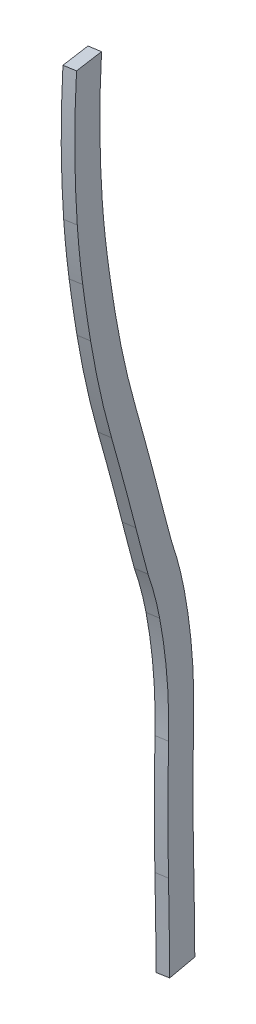
ISO-10303-21;
HEADER;
FILE_DESCRIPTION(('STEP AP214'),'2;1');
FILE_NAME('part.step','',(''),(''),'','','');
FILE_SCHEMA(('AUTOMOTIVE_DESIGN { 1 0 10303 214 1 1 1 1 }'));
ENDSEC;
DATA;
#1=APPLICATION_CONTEXT('core data for automotive mechanical design processes');
#2=APPLICATION_PROTOCOL_DEFINITION('international standard','automotive_design',2000,#1);
#3=PRODUCT_CONTEXT('',#1,'mechanical');
#4=PRODUCT('Part','Part','',(#3));
#5=PRODUCT_RELATED_PRODUCT_CATEGORY('part','',(#4));
#6=PRODUCT_DEFINITION_FORMATION('','',#4);
#7=PRODUCT_DEFINITION_CONTEXT('part definition',#1,'design');
#8=PRODUCT_DEFINITION('design','',#6,#7);
#9=PRODUCT_DEFINITION_SHAPE('','',#8);
#10=(LENGTH_UNIT() NAMED_UNIT(*) SI_UNIT(.MILLI.,.METRE.));
#11=(NAMED_UNIT(*) PLANE_ANGLE_UNIT() SI_UNIT($,.RADIAN.));
#12=(NAMED_UNIT(*) SI_UNIT($,.STERADIAN.) SOLID_ANGLE_UNIT());
#13=UNCERTAINTY_MEASURE_WITH_UNIT(LENGTH_MEASURE(1.E-05),#10,'distance_accuracy_value','');
#14=(GEOMETRIC_REPRESENTATION_CONTEXT(3) GLOBAL_UNCERTAINTY_ASSIGNED_CONTEXT((#13)) GLOBAL_UNIT_ASSIGNED_CONTEXT((#10,
#11,#12)) REPRESENTATION_CONTEXT('',''));
#15=CARTESIAN_POINT('',(0.,0.,0.));
#16=DIRECTION('',(0.,0.,1.));
#17=DIRECTION('',(1.,0.,0.));
#18=AXIS2_PLACEMENT_3D('',#15,#16,#17);
#19=CARTESIAN_POINT('',(0.,825.,-1425.));
#20=DIRECTION('',(0.,-1.,0.));
#21=DIRECTION('',(1.,0.,0.));
#22=AXIS2_PLACEMENT_3D('',#19,#20,#21);
#23=PLANE('',#22);
#24=CARTESIAN_POINT('',(-13361.9749270405,825.,8113.05481453009));
#25=DIRECTION('',(0.,-1.,0.));
#26=DIRECTION('',(-0.983765245959672,0.,0.179460137194605));
#27=AXIS2_PLACEMENT_3D('',#24,#25,#26);
#28=ELLIPSE('',#27,448122.561313768,7038.47733663514);
#29=CARTESIAN_POINT('',(-720.427019288018,825.,-1344.10961444261));
#30=VERTEX_POINT('',#29);
#31=CARTESIAN_POINT('',(-705.667385032109,825.,-1346.79453017466));
#32=VERTEX_POINT('',#31);
#33=EDGE_CURVE('E164',#30,#32,#28,.T.);
#34=ORIENTED_EDGE('',*,*,#33,.T.);
#35=DIRECTION('',(0.179460137194605,0.,0.983765245959672));
#36=VECTOR('',#35,1.);
#37=CARTESIAN_POINT('',(556.828996534096,825.,5573.96281878388));
#38=LINE('',#37,#36);
#39=CARTESIAN_POINT('',(-698.485378511231,825.,-1307.42418017972));
#40=VERTEX_POINT('',#39);
#41=EDGE_CURVE('E314',#32,#40,#38,.T.);
#42=ORIENTED_EDGE('',*,*,#41,.T.);
#43=CARTESIAN_POINT('',(-13361.9749270405,825.,8113.05481453009));
#44=DIRECTION('',(0.,-1.,0.));
#45=DIRECTION('',(-0.983765245959672,0.,0.179460137194605));
#46=AXIS2_PLACEMENT_3D('',#43,#44,#45);
#47=ELLIPSE('',#46,445575.85957769,6998.47733663514);
#48=CARTESIAN_POINT('',(-713.245020405277,825.,-1304.73930631841));
#49=VERTEX_POINT('',#48);
#50=EDGE_CURVE('E32',#40,#49,#47,.F.);
#51=ORIENTED_EDGE('',*,*,#50,.T.);
#52=DIRECTION('',(0.179460137194605,0.,0.983765245959672));
#53=VECTOR('',#52,1.);
#54=CARTESIAN_POINT('',(542.070697318572,825.,5576.65505294529));
#55=LINE('',#54,#53);
#56=EDGE_CURVE('E11',#30,#49,#55,.T.);
#57=ORIENTED_EDGE('',*,*,#56,.F.);
#58=EDGE_LOOP('',(#34,#42,#51,#57));
#59=FACE_BOUND('',#58,.T.);
#60=ADVANCED_FACE('F17',(#59),#23,.T.);
#61=CARTESIAN_POINT('',(553.395269791667,602.802702860898,5574.58920508368));
#62=DIRECTION('',(-0.983643892522552,0.0157065899918101,0.179437999693241));
#63=DIRECTION('',(-0.179284144970904,0.0107209315098688,-0.983738917086039));
#64=AXIS2_PLACEMENT_3D('',#61,#62,#63);
#65=CYLINDRICAL_SURFACE('',#64,6998.47733663514);
#66=ORIENTED_EDGE('',*,*,#50,.F.);
#67=CARTESIAN_POINT('',(553.395269791667,602.802702860898,5574.58920508368));
#68=DIRECTION('',(0.983643892522552,-0.0157065899918101,-0.179437999693241));
#69=DIRECTION('',(-0.179284144970904,0.0107209315098688,-0.983738917086039));
#70=AXIS2_PLACEMENT_3D('',#67,#68,#69);
#71=CIRCLE('',#70,6998.47733663514);
#72=CARTESIAN_POINT('',(-695.896046515676,939.439296835912,-1303.24708563971));
#73=VERTEX_POINT('',#72);
#74=EDGE_CURVE('E177',#40,#73,#71,.T.);
#75=ORIENTED_EDGE('',*,*,#74,.T.);
#76=DIRECTION('',(-0.983643892522552,0.0157065899918101,0.179437999693241));
#77=VECTOR('',#76,1.);
#78=CARTESIAN_POINT('',(-695.896046515676,939.439296835912,-1303.24708563971));
#79=LINE('',#78,#77);
#80=CARTESIAN_POINT('',(-710.650704903515,939.674895685789,-1300.55551564431));
#81=VERTEX_POINT('',#80);
#82=EDGE_CURVE('E25',#73,#81,#79,.T.);
#83=ORIENTED_EDGE('',*,*,#82,.T.);
#84=CARTESIAN_POINT('',(538.64061140383,603.038301710775,5577.28077507908));
#85=DIRECTION('',(0.983643892522552,-0.0157065899918101,-0.179437999693241));
#86=DIRECTION('',(-0.179284144970904,0.0107209315098688,-0.983738917086039));
#87=AXIS2_PLACEMENT_3D('',#84,#85,#86);
#88=CIRCLE('',#87,6998.47733663514);
#89=EDGE_CURVE('E300',#49,#81,#88,.T.);
#90=ORIENTED_EDGE('',*,*,#89,.F.);
#91=EDGE_LOOP('',(#66,#75,#83,#90));
#92=FACE_BOUND('',#91,.T.);
#93=ADVANCED_FACE('F19',(#92),#65,.F.);
#94=CARTESIAN_POINT('',(553.395269791667,602.802702860898,5574.58920508368));
#95=DIRECTION('',(-0.983643892522552,0.0157065899918101,0.179437999693241));
#96=DIRECTION('',(-0.179284144970904,0.0107209315098688,-0.983738917086039));
#97=AXIS2_PLACEMENT_3D('',#94,#95,#96);
#98=CYLINDRICAL_SURFACE('',#97,7038.47733663514);
#99=ORIENTED_EDGE('',*,*,#33,.F.);
#100=CARTESIAN_POINT('',(538.64061140383,603.038301710775,5577.28077507908));
#101=DIRECTION('',(-0.983643892522552,0.0157065899918101,0.179437999693241));
#102=DIRECTION('',(-0.179284144970904,0.0107209315098688,-0.983738917086039));
#103=AXIS2_PLACEMENT_3D('',#100,#101,#102);
#104=CIRCLE('',#103,7038.47733663514);
#105=CARTESIAN_POINT('',(-717.79106562037,941.598951892658,-1339.86598825081));
#106=VERTEX_POINT('',#105);
#107=EDGE_CURVE('E170',#106,#30,#104,.T.);
#108=ORIENTED_EDGE('',*,*,#107,.F.);
#109=DIRECTION('',(-0.983643892522552,0.0157065899918101,0.179437999693241));
#110=VECTOR('',#109,1.);
#111=CARTESIAN_POINT('',(-703.036407232532,941.363353042781,-1342.55755824621));
#112=LINE('',#111,#110);
#113=CARTESIAN_POINT('',(-703.036407232532,941.363353042781,-1342.55755824621));
#114=VERTEX_POINT('',#113);
#115=EDGE_CURVE('E242',#114,#106,#112,.T.);
#116=ORIENTED_EDGE('',*,*,#115,.F.);
#117=CARTESIAN_POINT('',(553.395269791667,602.802702860898,5574.58920508368));
#118=DIRECTION('',(-0.983643892522552,0.0157065899918101,0.179437999693241));
#119=DIRECTION('',(-0.179284144970904,0.0107209315098688,-0.983738917086039));
#120=AXIS2_PLACEMENT_3D('',#117,#118,#119);
#121=CIRCLE('',#120,7038.47733663514);
#122=EDGE_CURVE('E39',#114,#32,#121,.T.);
#123=ORIENTED_EDGE('',*,*,#122,.T.);
#124=EDGE_LOOP('',(#99,#108,#116,#123));
#125=FACE_BOUND('',#124,.T.);
#126=ADVANCED_FACE('F169',(#125),#98,.T.);
#127=CARTESIAN_POINT('',(553.395269791667,602.802702860898,5574.58920508368));
#128=DIRECTION('',(-0.983643892522552,0.0157065899918101,0.179437999693241));
#129=DIRECTION('',(-0.179284144970904,0.0107209315098688,-0.983738917086039));
#130=AXIS2_PLACEMENT_3D('',#127,#128,#129);
#131=PLANE('',#130);
#132=ORIENTED_EDGE('',*,*,#41,.F.);
#133=ORIENTED_EDGE('',*,*,#122,.F.);
#134=CARTESIAN_POINT('',(-1219.22901401691,1080.45766892773,-4184.39932693663));
#135=DIRECTION('',(0.98364389252255,-0.0157065899918103,-0.179437999693253));
#136=DIRECTION('',(0.178509017921332,-0.0481014051745877,0.982761815162246));
#137=AXIS2_PLACEMENT_3D('',#134,#135,#136);
#138=CIRCLE('',#137,2891.68924234329);
#139=CARTESIAN_POINT('',(-700.077989029998,1094.30764319442,-1339.72762957827));
#140=VERTEX_POINT('',#139);
#141=EDGE_CURVE('E238',#140,#114,#138,.T.);
#142=ORIENTED_EDGE('',*,*,#141,.F.);
#143=CARTESIAN_POINT('',(-583.977924602023,1097.40497485186,-703.560981639801));
#144=DIRECTION('',(-0.983643892522549,0.0157065899918104,0.179437999693254));
#145=DIRECTION('',(-0.179532094038646,-0.00478957906813383,-0.983740457205277));
#146=AXIS2_PLACEMENT_3D('',#143,#144,#145);
#147=CIRCLE('',#146,646.681391701386);
#148=CARTESIAN_POINT('',(-694.267757230317,1252.14837018478,-1321.6932140889));
#149=VERTEX_POINT('',#148);
#150=EDGE_CURVE('E235',#149,#140,#147,.T.);
#151=ORIENTED_EDGE('',*,*,#150,.F.);
#152=CARTESIAN_POINT('',(-614.018625324626,1139.55391929412,-871.927593134996));
#153=DIRECTION('',(-0.983643892522549,0.0157065899918102,0.179437999693254));
#154=DIRECTION('',(-0.170547404090488,0.239288461549506,-0.955852820850191));
#155=AXIS2_PLACEMENT_3D('',#152,#153,#154);
#156=CIRCLE('',#155,470.538571569894);
#157=CARTESIAN_POINT('',(-689.440511209819,1317.48076330475,-1300.94988235197));
#158=VERTEX_POINT('',#157);
#159=EDGE_CURVE('E232',#158,#149,#156,.T.);
#160=ORIENTED_EDGE('',*,*,#159,.F.);
#161=CARTESIAN_POINT('',(-1591.75285028647,3040.81212301513,-6398.09587222628));
#162=DIRECTION('',(0.983643892522551,-0.0157065899918134,-0.179437999693245));
#163=DIRECTION('',(0.165379401888751,-0.31599222365054,0.934236890742014));
#164=AXIS2_PLACEMENT_3D('',#161,#162,#163);
#165=CIRCLE('',#164,5455.72504573892);
#166=CARTESIAN_POINT('',(-684.829292871299,1379.77772111795,-1281.12507385128));
#167=VERTEX_POINT('',#166);
#168=EDGE_CURVE('E229',#167,#158,#165,.T.);
#169=ORIENTED_EDGE('',*,*,#168,.F.);
#170=CARTESIAN_POINT('',(254.030528232484,-339.748085286874,4016.03393042758));
#171=DIRECTION('',(-0.983643892522544,0.0157065899918008,0.179437999693284));
#172=DIRECTION('',(-0.166233369499392,0.304457132273249,-0.937908482461283));
#173=AXIS2_PLACEMENT_3D('',#170,#171,#172);
#174=CIRCLE('',#173,5647.84209049685);
#175=CARTESIAN_POINT('',(-675.364600195873,1505.70026639228,-1240.26375479975));
#176=VERTEX_POINT('',#175);
#177=EDGE_CURVE('E226',#176,#167,#174,.T.);
#178=ORIENTED_EDGE('',*,*,#177,.F.);
#179=CARTESIAN_POINT('',(-855.383266577352,1863.15334634015,-2258.3793769453));
#180=DIRECTION('',(0.98364389252255,-0.0157065899918113,-0.179437999693251));
#181=DIRECTION('',(0.164557562611741,-0.326752823841228,0.930673627379151));
#182=AXIS2_PLACEMENT_3D('',#179,#180,#181);
#183=CIRCLE('',#182,1093.95559538164);
#184=CARTESIAN_POINT('',(-667.136477576721,1630.73672037302,-1206.10350861427));
#185=VERTEX_POINT('',#184);
#186=EDGE_CURVE('E223',#185,#176,#183,.T.);
#187=ORIENTED_EDGE('',*,*,#186,.F.);
#188=CARTESIAN_POINT('',(-1006.12746733741,2049.26785437904,-3101.02049498356));
#189=DIRECTION('',(0.983643892522547,-0.0157065899918063,-0.179437999693274));
#190=DIRECTION('',(0.172079003750589,-0.21245526504762,0.961899982753794));
#191=AXIS2_PLACEMENT_3D('',#188,#189,#190);
#192=CIRCLE('',#191,1969.97299131286);
#193=CARTESIAN_POINT('',(-663.566059583929,1700.61499243701,-1192.64777188156));
#194=VERTEX_POINT('',#193);
#195=EDGE_CURVE('E220',#194,#185,#192,.T.);
#196=ORIENTED_EDGE('',*,*,#195,.F.);
#197=CARTESIAN_POINT('',(-832.792059887472,1872.85018293253,-2135.3876010317));
#198=DIRECTION('',(0.983643892522547,-0.015706589991809,-0.179437999693267));
#199=DIRECTION('',(0.173891423519045,-0.176983574637577,0.968730399613342));
#200=AXIS2_PLACEMENT_3D('',#197,#198,#199);
#201=CIRCLE('',#200,973.170481205524);
#202=CARTESIAN_POINT('',(-660.699816080751,1770.42501455506,-1183.04620741583));
#203=VERTEX_POINT('',#202);
#204=EDGE_CURVE('E217',#203,#194,#201,.T.);
#205=ORIENTED_EDGE('',*,*,#204,.F.);
#206=CARTESIAN_POINT('',(-857.955483133816,1887.82684780684,-2274.63948730208));
#207=DIRECTION('',(0.98364389252255,-0.0157065899918109,-0.179437999693249));
#208=DIRECTION('',(0.176836687024787,-0.105248946978523,0.9785966714035));
#209=AXIS2_PLACEMENT_3D('',#206,#207,#208);
#210=CIRCLE('',#209,1115.46800820474);
#211=CARTESIAN_POINT('',(-657.187789429413,1939.79237158444,-1178.61905189434));
#212=VERTEX_POINT('',#211);
#213=EDGE_CURVE('E214',#212,#203,#210,.T.);
#214=ORIENTED_EDGE('',*,*,#213,.F.);
#215=DIRECTION('',(-0.179985165175218,-0.0465862968685581,-0.982565548582344));
#216=VECTOR('',#215,1.);
#217=CARTESIAN_POINT('',(-649.988382822404,1941.65582345919,-1139.31642995104));
#218=LINE('',#217,#216);
#219=CARTESIAN_POINT('',(-649.988382822404,1941.65582345919,-1139.31642995104));
#220=VERTEX_POINT('',#219);
#221=EDGE_CURVE('E211',#220,#212,#218,.T.);
#222=ORIENTED_EDGE('',*,*,#221,.F.);
#223=CARTESIAN_POINT('',(-857.955483133816,1887.82684780684,-2274.63948730208));
#224=DIRECTION('',(-0.98364389252255,0.0157065899918109,0.179437999693249));
#225=DIRECTION('',(0.176836687024787,-0.105248946978523,0.9785966714035));
#226=AXIS2_PLACEMENT_3D('',#223,#224,#225);
#227=CIRCLE('',#226,1155.46800820474);
#228=CARTESIAN_POINT('',(-653.626348599759,1766.21505667592,-1143.90234055969));
#229=VERTEX_POINT('',#228);
#230=EDGE_CURVE('E208',#229,#220,#227,.T.);
#231=ORIENTED_EDGE('',*,*,#230,.F.);
#232=CARTESIAN_POINT('',(-832.792059887472,1872.85018293253,-2135.3876010317));
#233=DIRECTION('',(-0.983643892522547,0.015706589991809,0.179437999693267));
#234=DIRECTION('',(0.173891423519045,-0.176983574637577,0.968730399613342));
#235=AXIS2_PLACEMENT_3D('',#232,#233,#234);
#236=CIRCLE('',#235,1013.17048120552);
#237=CARTESIAN_POINT('',(-656.610402643167,1693.5356494515,-1153.89855589703));
#238=VERTEX_POINT('',#237);
#239=EDGE_CURVE('E205',#238,#229,#236,.T.);
#240=ORIENTED_EDGE('',*,*,#239,.F.);
#241=CARTESIAN_POINT('',(-1006.12746733741,2049.26785437904,-3101.02049498356));
#242=DIRECTION('',(-0.983643892522546,0.0157065899918064,0.179437999693273));
#243=DIRECTION('',(0.172079003750589,-0.21245526504762,0.961899982753794));
#244=AXIS2_PLACEMENT_3D('',#241,#242,#243);
#245=CIRCLE('',#244,2009.97299131286);
#246=CARTESIAN_POINT('',(-660.253317426698,1622.23850977111,-1167.62750930412));
#247=VERTEX_POINT('',#246);
#248=EDGE_CURVE('E202',#247,#238,#245,.T.);
#249=ORIENTED_EDGE('',*,*,#248,.F.);
#250=CARTESIAN_POINT('',(-855.383266577352,1863.15334634015,-2258.3793769453));
#251=DIRECTION('',(-0.98364389252255,0.0157065899918112,0.17943799969325));
#252=DIRECTION('',(0.164557562611741,-0.326752823841228,0.930673627379151));
#253=AXIS2_PLACEMENT_3D('',#250,#251,#252);
#254=CIRCLE('',#253,1133.95559538164);
#255=CARTESIAN_POINT('',(-668.782297691407,1492.63015343858,-1203.0368097046));
#256=VERTEX_POINT('',#255);
#257=EDGE_CURVE('E199',#256,#247,#254,.T.);
#258=ORIENTED_EDGE('',*,*,#257,.F.);
#259=CARTESIAN_POINT('',(254.030528232484,-339.748085286874,4016.03393042758));
#260=DIRECTION('',(0.983643892522545,-0.0157065899918008,-0.179437999693284));
#261=DIRECTION('',(-0.166233369499392,0.304457132273249,-0.937908482461283));
#262=AXIS2_PLACEMENT_3D('',#259,#260,#261);
#263=CIRCLE('',#262,5607.84209049685);
#264=CARTESIAN_POINT('',(-678.179958091323,1367.59943582703,-1243.60873455283));
#265=VERTEX_POINT('',#264);
#266=EDGE_CURVE('E196',#265,#256,#263,.T.);
#267=ORIENTED_EDGE('',*,*,#266,.F.);
#268=CARTESIAN_POINT('',(-1591.75285028647,3040.81212301513,-6398.09587222628));
#269=DIRECTION('',(-0.983643892522552,0.0157065899918134,0.179437999693245));
#270=DIRECTION('',(0.165379401888751,-0.31599222365054,0.934236890742014));
#271=AXIS2_PLACEMENT_3D('',#268,#269,#270);
#272=CIRCLE('',#271,5495.72504573892);
#273=CARTESIAN_POINT('',(-682.922101044978,1303.55497544569,-1263.99828347574));
#274=VERTEX_POINT('',#273);
#275=EDGE_CURVE('E193',#274,#265,#272,.T.);
#276=ORIENTED_EDGE('',*,*,#275,.F.);
#277=CARTESIAN_POINT('',(-614.018625324626,1139.55391929412,-871.927593134996));
#278=DIRECTION('',(0.98364389252255,-0.0157065899918102,-0.179437999693254));
#279=DIRECTION('',(-0.170547404090488,0.239288461549505,-0.955852820850191));
#280=AXIS2_PLACEMENT_3D('',#277,#278,#279);
#281=CIRCLE('',#280,430.538571569894);
#282=CARTESIAN_POINT('',(-687.445861066698,1242.5768317228,-1283.45910125489));
#283=VERTEX_POINT('',#282);
#284=EDGE_CURVE('E190',#283,#274,#281,.T.);
#285=ORIENTED_EDGE('',*,*,#284,.F.);
#286=CARTESIAN_POINT('',(-583.977924602023,1097.40497485186,-703.560981639801));
#287=DIRECTION('',(0.983643892522549,-0.0157065899918104,-0.179437999693253));
#288=DIRECTION('',(-0.179532094038646,-0.00478957906813377,-0.983740457205277));
#289=AXIS2_PLACEMENT_3D('',#286,#287,#288);
#290=CIRCLE('',#289,606.681391701386);
#291=CARTESIAN_POINT('',(-692.896705268452,1094.49922635715,-1300.37801129006));
#292=VERTEX_POINT('',#291);
#293=EDGE_CURVE('E187',#292,#283,#290,.T.);
#294=ORIENTED_EDGE('',*,*,#293,.F.);
#295=CARTESIAN_POINT('',(-1219.22901401691,1080.45766892773,-4184.39932693663));
#296=DIRECTION('',(-0.98364389252255,0.0157065899918102,0.179437999693253));
#297=DIRECTION('',(0.178509017921332,-0.0481014051745877,0.982761815162246));
#298=AXIS2_PLACEMENT_3D('',#295,#296,#297);
#299=CIRCLE('',#298,2931.68924234329);
#300=EDGE_CURVE('E179',#73,#292,#299,.T.);
#301=ORIENTED_EDGE('',*,*,#300,.F.);
#302=ORIENTED_EDGE('',*,*,#74,.F.);
#303=EDGE_LOOP('',(#132,#133,#142,#151,#160,#169,#178,#187,#196,#205,#214,#222,#231,#240,#249,
#258,#267,#276,#285,#294,#301,#302));
#304=FACE_BOUND('',#303,.T.);
#305=ADVANCED_FACE('F368',(#304),#131,.F.);
#306=CARTESIAN_POINT('',(538.64061140383,603.038301710775,5577.28077507908));
#307=DIRECTION('',(-0.983643892522552,0.0157065899918101,0.179437999693241));
#308=DIRECTION('',(-0.179284144970904,0.0107209315098688,-0.983738917086039));
#309=AXIS2_PLACEMENT_3D('',#306,#307,#308);
#310=PLANE('',#309);
#311=ORIENTED_EDGE('',*,*,#107,.T.);
#312=ORIENTED_EDGE('',*,*,#56,.T.);
#313=ORIENTED_EDGE('',*,*,#89,.T.);
#314=CARTESIAN_POINT('',(-1233.98367240475,1080.69326777761,-4181.70775694124));
#315=DIRECTION('',(-0.98364389252255,0.0157065899918102,0.179437999693253));
#316=DIRECTION('',(0.178509017921332,-0.0481014051745877,0.982761815162246));
#317=AXIS2_PLACEMENT_3D('',#314,#315,#316);
#318=CIRCLE('',#317,2931.68924234329);
#319=CARTESIAN_POINT('',(-707.65136365629,1094.73482520703,-1297.68644129466));
#320=VERTEX_POINT('',#319);
#321=EDGE_CURVE('E307',#81,#320,#318,.T.);
#322=ORIENTED_EDGE('',*,*,#321,.T.);
#323=CARTESIAN_POINT('',(-598.73258298986,1097.64057370174,-700.869411644403));
#324=DIRECTION('',(0.983643892522549,-0.0157065899918104,-0.179437999693253));
#325=DIRECTION('',(-0.179532094038646,-0.00478957906813377,-0.983740457205277));
#326=AXIS2_PLACEMENT_3D('',#323,#324,#325);
#327=CIRCLE('',#326,606.681391701386);
#328=CARTESIAN_POINT('',(-702.200519454536,1242.81243057268,-1280.76753125949));
#329=VERTEX_POINT('',#328);
#330=EDGE_CURVE('E310',#320,#329,#327,.T.);
#331=ORIENTED_EDGE('',*,*,#330,.T.);
#332=CARTESIAN_POINT('',(-628.773283712464,1139.789518144,-869.236023139597));
#333=DIRECTION('',(0.98364389252255,-0.0157065899918102,-0.179437999693254));
#334=DIRECTION('',(-0.170547404090488,0.239288461549505,-0.955852820850191));
#335=AXIS2_PLACEMENT_3D('',#332,#333,#334);
#336=CIRCLE('',#335,430.538571569894);
#337=CARTESIAN_POINT('',(-697.676759432816,1303.79057429557,-1261.30671348034));
#338=VERTEX_POINT('',#337);
#339=EDGE_CURVE('E312',#329,#338,#336,.T.);
#340=ORIENTED_EDGE('',*,*,#339,.T.);
#341=CARTESIAN_POINT('',(-1606.50750867431,3041.04772186501,-6395.40430223088));
#342=DIRECTION('',(-0.983643892522552,0.0157065899918134,0.179437999693245));
#343=DIRECTION('',(0.165379401888751,-0.31599222365054,0.934236890742014));
#344=AXIS2_PLACEMENT_3D('',#341,#342,#343);
#345=CIRCLE('',#344,5495.72504573892);
#346=CARTESIAN_POINT('',(-692.934616479161,1367.83503467691,-1240.91716455743));
#347=VERTEX_POINT('',#346);
#348=EDGE_CURVE('E320',#338,#347,#345,.T.);
#349=ORIENTED_EDGE('',*,*,#348,.T.);
#350=CARTESIAN_POINT('',(239.275869844645,-339.512486436996,4018.72550042298));
#351=DIRECTION('',(0.983643892522545,-0.0157065899918008,-0.179437999693284));
#352=DIRECTION('',(-0.166233369499392,0.304457132273249,-0.937908482461283));
#353=AXIS2_PLACEMENT_3D('',#350,#351,#352);
#354=CIRCLE('',#353,5607.84209049685);
#355=CARTESIAN_POINT('',(-683.536956079246,1492.86575228845,-1200.3452397092));
#356=VERTEX_POINT('',#355);
#357=EDGE_CURVE('E323',#347,#356,#354,.T.);
#358=ORIENTED_EDGE('',*,*,#357,.T.);
#359=CARTESIAN_POINT('',(-870.13792496519,1863.38894519002,-2255.6878069499));
#360=DIRECTION('',(-0.98364389252255,0.0157065899918112,0.17943799969325));
#361=DIRECTION('',(0.164557562611741,-0.326752823841228,0.930673627379151));
#362=AXIS2_PLACEMENT_3D('',#359,#360,#361);
#363=CIRCLE('',#362,1133.95559538164);
#364=CARTESIAN_POINT('',(-675.007975814537,1622.47410862099,-1164.93593930873));
#365=VERTEX_POINT('',#364);
#366=EDGE_CURVE('E326',#356,#365,#363,.T.);
#367=ORIENTED_EDGE('',*,*,#366,.T.);
#368=CARTESIAN_POINT('',(-1020.88212572524,2049.50345322892,-3098.32892498816));
#369=DIRECTION('',(-0.983643892522546,0.0157065899918064,0.179437999693273));
#370=DIRECTION('',(0.172079003750589,-0.21245526504762,0.961899982753794));
#371=AXIS2_PLACEMENT_3D('',#368,#369,#370);
#372=CIRCLE('',#371,2009.97299131286);
#373=CARTESIAN_POINT('',(-671.365061031006,1693.77124830138,-1151.20698590163));
#374=VERTEX_POINT('',#373);
#375=EDGE_CURVE('E329',#365,#374,#372,.T.);
#376=ORIENTED_EDGE('',*,*,#375,.T.);
#377=CARTESIAN_POINT('',(-847.54671827531,1873.08578178241,-2132.6960310363));
#378=DIRECTION('',(-0.983643892522547,0.015706589991809,0.179437999693267));
#379=DIRECTION('',(0.173891423519045,-0.176983574637577,0.968730399613342));
#380=AXIS2_PLACEMENT_3D('',#377,#378,#379);
#381=CIRCLE('',#380,1013.17048120552);
#382=CARTESIAN_POINT('',(-668.381006987597,1766.4506555258,-1141.21077056429));
#383=VERTEX_POINT('',#382);
#384=EDGE_CURVE('E332',#374,#383,#381,.T.);
#385=ORIENTED_EDGE('',*,*,#384,.T.);
#386=CARTESIAN_POINT('',(-872.710141521654,1888.06244665672,-2271.94791730669));
#387=DIRECTION('',(-0.98364389252255,0.0157065899918109,0.179437999693249));
#388=DIRECTION('',(0.176836687024787,-0.105248946978523,0.9785966714035));
#389=AXIS2_PLACEMENT_3D('',#386,#387,#388);
#390=CIRCLE('',#389,1155.46800820474);
#391=CARTESIAN_POINT('',(-664.743041210242,1941.89142230907,-1136.62485995565));
#392=VERTEX_POINT('',#391);
#393=EDGE_CURVE('E335',#383,#392,#390,.T.);
#394=ORIENTED_EDGE('',*,*,#393,.T.);
#395=DIRECTION('',(-0.179985165175218,-0.0465862968685581,-0.982565548582344));
#396=VECTOR('',#395,1.);
#397=CARTESIAN_POINT('',(-664.743041210242,1941.89142230907,-1136.62485995565));
#398=LINE('',#397,#396);
#399=CARTESIAN_POINT('',(-671.942447817251,1940.02797043432,-1175.92748189894));
#400=VERTEX_POINT('',#399);
#401=EDGE_CURVE('E338',#392,#400,#398,.T.);
#402=ORIENTED_EDGE('',*,*,#401,.T.);
#403=CARTESIAN_POINT('',(-872.710141521654,1888.06244665672,-2271.94791730669));
#404=DIRECTION('',(0.98364389252255,-0.0157065899918109,-0.179437999693249));
#405=DIRECTION('',(0.176836687024787,-0.105248946978523,0.9785966714035));
#406=AXIS2_PLACEMENT_3D('',#403,#404,#405);
#407=CIRCLE('',#406,1115.46800820474);
#408=CARTESIAN_POINT('',(-675.454474468589,1770.66061340494,-1180.35463742044));
#409=VERTEX_POINT('',#408);
#410=EDGE_CURVE('E341',#400,#409,#407,.T.);
#411=ORIENTED_EDGE('',*,*,#410,.T.);
#412=CARTESIAN_POINT('',(-847.54671827531,1873.08578178241,-2132.6960310363));
#413=DIRECTION('',(0.983643892522547,-0.015706589991809,-0.179437999693267));
#414=DIRECTION('',(0.173891423519045,-0.176983574637577,0.968730399613342));
#415=AXIS2_PLACEMENT_3D('',#412,#413,#414);
#416=CIRCLE('',#415,973.170481205524);
#417=CARTESIAN_POINT('',(-678.320717971768,1700.85059128688,-1189.95620188616));
#418=VERTEX_POINT('',#417);
#419=EDGE_CURVE('E344',#409,#418,#416,.T.);
#420=ORIENTED_EDGE('',*,*,#419,.T.);
#421=CARTESIAN_POINT('',(-1020.88212572524,2049.50345322892,-3098.32892498816));
#422=DIRECTION('',(0.983643892522547,-0.0157065899918063,-0.179437999693274));
#423=DIRECTION('',(0.172079003750589,-0.21245526504762,0.961899982753794));
#424=AXIS2_PLACEMENT_3D('',#421,#422,#423);
#425=CIRCLE('',#424,1969.97299131286);
#426=CARTESIAN_POINT('',(-681.89113596456,1630.97231922289,-1203.41193861888));
#427=VERTEX_POINT('',#426);
#428=EDGE_CURVE('E347',#418,#427,#425,.T.);
#429=ORIENTED_EDGE('',*,*,#428,.T.);
#430=CARTESIAN_POINT('',(-870.13792496519,1863.38894519002,-2255.6878069499));
#431=DIRECTION('',(0.98364389252255,-0.0157065899918113,-0.179437999693251));
#432=DIRECTION('',(0.164557562611741,-0.326752823841228,0.930673627379151));
#433=AXIS2_PLACEMENT_3D('',#430,#431,#432);
#434=CIRCLE('',#433,1093.95559538164);
#435=CARTESIAN_POINT('',(-690.119258583712,1505.93586524216,-1237.57218480435));
#436=VERTEX_POINT('',#435);
#437=EDGE_CURVE('E350',#427,#436,#434,.T.);
#438=ORIENTED_EDGE('',*,*,#437,.T.);
#439=CARTESIAN_POINT('',(239.275869844645,-339.512486436996,4018.72550042298));
#440=DIRECTION('',(-0.983643892522544,0.0157065899918008,0.179437999693284));
#441=DIRECTION('',(-0.166233369499392,0.304457132273249,-0.937908482461283));
#442=AXIS2_PLACEMENT_3D('',#439,#440,#441);
#443=CIRCLE('',#442,5647.84209049685);
#444=CARTESIAN_POINT('',(-699.583951259137,1380.01331996783,-1278.43350385589));
#445=VERTEX_POINT('',#444);
#446=EDGE_CURVE('E353',#436,#445,#443,.T.);
#447=ORIENTED_EDGE('',*,*,#446,.T.);
#448=CARTESIAN_POINT('',(-1606.50750867431,3041.04772186501,-6395.40430223088));
#449=DIRECTION('',(0.983643892522551,-0.0157065899918134,-0.179437999693245));
#450=DIRECTION('',(0.165379401888751,-0.31599222365054,0.934236890742014));
#451=AXIS2_PLACEMENT_3D('',#448,#449,#450);
#452=CIRCLE('',#451,5455.72504573892);
#453=CARTESIAN_POINT('',(-704.195169597658,1317.71636215463,-1298.25831235657));
#454=VERTEX_POINT('',#453);
#455=EDGE_CURVE('E356',#445,#454,#452,.T.);
#456=ORIENTED_EDGE('',*,*,#455,.T.);
#457=CARTESIAN_POINT('',(-628.773283712464,1139.789518144,-869.236023139597));
#458=DIRECTION('',(-0.983643892522549,0.0157065899918102,0.179437999693254));
#459=DIRECTION('',(-0.170547404090488,0.239288461549506,-0.955852820850191));
#460=AXIS2_PLACEMENT_3D('',#457,#458,#459);
#461=CIRCLE('',#460,470.538571569894);
#462=CARTESIAN_POINT('',(-709.022415618155,1252.38396903466,-1319.0016440935));
#463=VERTEX_POINT('',#462);
#464=EDGE_CURVE('E359',#454,#463,#461,.T.);
#465=ORIENTED_EDGE('',*,*,#464,.T.);
#466=CARTESIAN_POINT('',(-598.73258298986,1097.64057370174,-700.869411644403));
#467=DIRECTION('',(-0.983643892522549,0.0157065899918104,0.179437999693254));
#468=DIRECTION('',(-0.179532094038646,-0.00478957906813383,-0.983740457205277));
#469=AXIS2_PLACEMENT_3D('',#466,#467,#468);
#470=CIRCLE('',#469,646.681391701386);
#471=CARTESIAN_POINT('',(-714.832647417837,1094.5432420443,-1337.03605958287));
#472=VERTEX_POINT('',#471);
#473=EDGE_CURVE('E181',#463,#472,#470,.T.);
#474=ORIENTED_EDGE('',*,*,#473,.T.);
#475=CARTESIAN_POINT('',(-1233.98367240475,1080.69326777761,-4181.70775694124));
#476=DIRECTION('',(0.98364389252255,-0.0157065899918103,-0.179437999693253));
#477=DIRECTION('',(0.178509017921332,-0.0481014051745877,0.982761815162246));
#478=AXIS2_PLACEMENT_3D('',#475,#476,#477);
#479=CIRCLE('',#478,2891.68924234329);
#480=EDGE_CURVE('E176',#472,#106,#479,.T.);
#481=ORIENTED_EDGE('',*,*,#480,.T.);
#482=EDGE_LOOP('',(#311,#312,#313,#322,#331,#340,#349,#358,#367,#376,#385,#394,#402,#411,#420,
#429,#438,#447,#456,#465,#474,#481));
#483=FACE_BOUND('',#482,.T.);
#484=ADVANCED_FACE('F174',(#483),#310,.T.);
#485=CARTESIAN_POINT('',(-1219.22901401691,1080.45766892773,-4184.39932693663));
#486=DIRECTION('',(-0.983643892522552,0.0157065899918101,0.179437999693241));
#487=DIRECTION('',(-0.179284144970904,0.0107209315098688,-0.983738917086039));
#488=AXIS2_PLACEMENT_3D('',#485,#486,#487);
#489=CYLINDRICAL_SURFACE('',#488,2931.68924234329);
#490=ORIENTED_EDGE('',*,*,#321,.F.);
#491=ORIENTED_EDGE('',*,*,#82,.F.);
#492=ORIENTED_EDGE('',*,*,#300,.T.);
#493=DIRECTION('',(-0.983643892522552,0.0157065899918101,0.179437999693241));
#494=VECTOR('',#493,1.);
#495=CARTESIAN_POINT('',(-692.896705268452,1094.49922635715,-1300.37801129006));
#496=LINE('',#495,#494);
#497=EDGE_CURVE('E295',#292,#320,#496,.T.);
#498=ORIENTED_EDGE('',*,*,#497,.T.);
#499=EDGE_LOOP('',(#490,#491,#492,#498));
#500=FACE_BOUND('',#499,.T.);
#501=ADVANCED_FACE('F305',(#500),#489,.T.);
#502=CARTESIAN_POINT('',(-583.977924602023,1097.40497485186,-703.560981639801));
#503=DIRECTION('',(-0.983643892522552,0.0157065899918101,0.179437999693241));
#504=DIRECTION('',(-0.179284144970904,0.0107209315098688,-0.983738917086039));
#505=AXIS2_PLACEMENT_3D('',#502,#503,#504);
#506=CYLINDRICAL_SURFACE('',#505,606.681391701386);
#507=ORIENTED_EDGE('',*,*,#330,.F.);
#508=ORIENTED_EDGE('',*,*,#497,.F.);
#509=ORIENTED_EDGE('',*,*,#293,.T.);
#510=DIRECTION('',(-0.983643892522552,0.0157065899918101,0.179437999693241));
#511=VECTOR('',#510,1.);
#512=CARTESIAN_POINT('',(-687.445861066698,1242.5768317228,-1283.45910125489));
#513=LINE('',#512,#511);
#514=EDGE_CURVE('E292',#283,#329,#513,.T.);
#515=ORIENTED_EDGE('',*,*,#514,.T.);
#516=EDGE_LOOP('',(#507,#508,#509,#515));
#517=FACE_BOUND('',#516,.T.);
#518=ADVANCED_FACE('F414',(#517),#506,.F.);
#519=CARTESIAN_POINT('',(-614.018625324626,1139.55391929412,-871.927593134996));
#520=DIRECTION('',(-0.983643892522552,0.0157065899918101,0.179437999693241));
#521=DIRECTION('',(-0.179284144970904,0.0107209315098688,-0.983738917086039));
#522=AXIS2_PLACEMENT_3D('',#519,#520,#521);
#523=CYLINDRICAL_SURFACE('',#522,430.538571569894);
#524=ORIENTED_EDGE('',*,*,#339,.F.);
#525=ORIENTED_EDGE('',*,*,#514,.F.);
#526=ORIENTED_EDGE('',*,*,#284,.T.);
#527=DIRECTION('',(-0.983643892522552,0.0157065899918101,0.179437999693241));
#528=VECTOR('',#527,1.);
#529=CARTESIAN_POINT('',(-682.922101044978,1303.55497544569,-1263.99828347574));
#530=LINE('',#529,#528);
#531=EDGE_CURVE('E289',#274,#338,#530,.T.);
#532=ORIENTED_EDGE('',*,*,#531,.T.);
#533=EDGE_LOOP('',(#524,#525,#526,#532));
#534=FACE_BOUND('',#533,.T.);
#535=ADVANCED_FACE('F421',(#534),#523,.F.);
#536=CARTESIAN_POINT('',(-1591.75285028647,3040.81212301513,-6398.09587222628));
#537=DIRECTION('',(-0.983643892522552,0.0157065899918101,0.179437999693241));
#538=DIRECTION('',(-0.179284144970904,0.0107209315098688,-0.983738917086039));
#539=AXIS2_PLACEMENT_3D('',#536,#537,#538);
#540=CYLINDRICAL_SURFACE('',#539,5495.72504573892);
#541=ORIENTED_EDGE('',*,*,#348,.F.);
#542=ORIENTED_EDGE('',*,*,#531,.F.);
#543=ORIENTED_EDGE('',*,*,#275,.T.);
#544=DIRECTION('',(-0.983643892522552,0.0157065899918101,0.179437999693241));
#545=VECTOR('',#544,1.);
#546=CARTESIAN_POINT('',(-678.179958091323,1367.59943582703,-1243.60873455283));
#547=LINE('',#546,#545);
#548=EDGE_CURVE('E286',#265,#347,#547,.T.);
#549=ORIENTED_EDGE('',*,*,#548,.T.);
#550=EDGE_LOOP('',(#541,#542,#543,#549));
#551=FACE_BOUND('',#550,.T.);
#552=ADVANCED_FACE('F430',(#551),#540,.T.);
#553=CARTESIAN_POINT('',(254.030528232484,-339.748085286874,4016.03393042758));
#554=DIRECTION('',(-0.983643892522552,0.0157065899918101,0.179437999693241));
#555=DIRECTION('',(-0.179284144970904,0.0107209315098688,-0.983738917086039));
#556=AXIS2_PLACEMENT_3D('',#553,#554,#555);
#557=CYLINDRICAL_SURFACE('',#556,5607.84209049685);
#558=ORIENTED_EDGE('',*,*,#357,.F.);
#559=ORIENTED_EDGE('',*,*,#548,.F.);
#560=ORIENTED_EDGE('',*,*,#266,.T.);
#561=DIRECTION('',(-0.983643892522552,0.0157065899918101,0.179437999693241));
#562=VECTOR('',#561,1.);
#563=CARTESIAN_POINT('',(-668.782297691407,1492.63015343858,-1203.0368097046));
#564=LINE('',#563,#562);
#565=EDGE_CURVE('E283',#256,#356,#564,.T.);
#566=ORIENTED_EDGE('',*,*,#565,.T.);
#567=EDGE_LOOP('',(#558,#559,#560,#566));
#568=FACE_BOUND('',#567,.T.);
#569=ADVANCED_FACE('F439',(#568),#557,.F.);
#570=CARTESIAN_POINT('',(-855.383266577352,1863.15334634015,-2258.3793769453));
#571=DIRECTION('',(-0.983643892522552,0.0157065899918101,0.179437999693241));
#572=DIRECTION('',(-0.179284144970904,0.0107209315098688,-0.983738917086039));
#573=AXIS2_PLACEMENT_3D('',#570,#571,#572);
#574=CYLINDRICAL_SURFACE('',#573,1133.95559538164);
#575=ORIENTED_EDGE('',*,*,#366,.F.);
#576=ORIENTED_EDGE('',*,*,#565,.F.);
#577=ORIENTED_EDGE('',*,*,#257,.T.);
#578=DIRECTION('',(-0.983643892522552,0.0157065899918101,0.179437999693241));
#579=VECTOR('',#578,1.);
#580=CARTESIAN_POINT('',(-660.253317426698,1622.23850977111,-1167.62750930412));
#581=LINE('',#580,#579);
#582=EDGE_CURVE('E280',#247,#365,#581,.T.);
#583=ORIENTED_EDGE('',*,*,#582,.T.);
#584=EDGE_LOOP('',(#575,#576,#577,#583));
#585=FACE_BOUND('',#584,.T.);
#586=ADVANCED_FACE('F448',(#585),#574,.T.);
#587=CARTESIAN_POINT('',(-1006.12746733741,2049.26785437904,-3101.02049498356));
#588=DIRECTION('',(-0.983643892522552,0.0157065899918101,0.179437999693241));
#589=DIRECTION('',(-0.179284144970904,0.0107209315098688,-0.983738917086039));
#590=AXIS2_PLACEMENT_3D('',#587,#588,#589);
#591=CYLINDRICAL_SURFACE('',#590,2009.97299131286);
#592=ORIENTED_EDGE('',*,*,#375,.F.);
#593=ORIENTED_EDGE('',*,*,#582,.F.);
#594=ORIENTED_EDGE('',*,*,#248,.T.);
#595=DIRECTION('',(-0.983643892522552,0.0157065899918101,0.179437999693241));
#596=VECTOR('',#595,1.);
#597=CARTESIAN_POINT('',(-656.610402643167,1693.5356494515,-1153.89855589703));
#598=LINE('',#597,#596);
#599=EDGE_CURVE('E277',#238,#374,#598,.T.);
#600=ORIENTED_EDGE('',*,*,#599,.T.);
#601=EDGE_LOOP('',(#592,#593,#594,#600));
#602=FACE_BOUND('',#601,.T.);
#603=ADVANCED_FACE('F457',(#602),#591,.T.);
#604=CARTESIAN_POINT('',(-832.792059887472,1872.85018293253,-2135.3876010317));
#605=DIRECTION('',(-0.983643892522552,0.0157065899918101,0.179437999693241));
#606=DIRECTION('',(-0.179284144970904,0.0107209315098688,-0.983738917086039));
#607=AXIS2_PLACEMENT_3D('',#604,#605,#606);
#608=CYLINDRICAL_SURFACE('',#607,1013.17048120552);
#609=ORIENTED_EDGE('',*,*,#384,.F.);
#610=ORIENTED_EDGE('',*,*,#599,.F.);
#611=ORIENTED_EDGE('',*,*,#239,.T.);
#612=DIRECTION('',(-0.983643892522552,0.0157065899918101,0.179437999693241));
#613=VECTOR('',#612,1.);
#614=CARTESIAN_POINT('',(-653.626348599759,1766.21505667592,-1143.90234055969));
#615=LINE('',#614,#613);
#616=EDGE_CURVE('E274',#229,#383,#615,.T.);
#617=ORIENTED_EDGE('',*,*,#616,.T.);
#618=EDGE_LOOP('',(#609,#610,#611,#617));
#619=FACE_BOUND('',#618,.T.);
#620=ADVANCED_FACE('F466',(#619),#608,.T.);
#621=CARTESIAN_POINT('',(-857.955483133816,1887.82684780684,-2274.63948730208));
#622=DIRECTION('',(-0.983643892522552,0.0157065899918101,0.179437999693241));
#623=DIRECTION('',(-0.179284144970904,0.0107209315098688,-0.983738917086039));
#624=AXIS2_PLACEMENT_3D('',#621,#622,#623);
#625=CYLINDRICAL_SURFACE('',#624,1155.46800820474);
#626=ORIENTED_EDGE('',*,*,#393,.F.);
#627=ORIENTED_EDGE('',*,*,#616,.F.);
#628=ORIENTED_EDGE('',*,*,#230,.T.);
#629=DIRECTION('',(-0.983643892522552,0.0157065899918101,0.179437999693241));
#630=VECTOR('',#629,1.);
#631=CARTESIAN_POINT('',(-649.988382822404,1941.65582345919,-1139.31642995104));
#632=LINE('',#631,#630);
#633=EDGE_CURVE('E271',#220,#392,#632,.T.);
#634=ORIENTED_EDGE('',*,*,#633,.T.);
#635=EDGE_LOOP('',(#626,#627,#628,#634));
#636=FACE_BOUND('',#635,.T.);
#637=ADVANCED_FACE('F475',(#636),#625,.T.);
#638=CARTESIAN_POINT('',(-649.988382822404,1941.65582345919,-1139.31642995104));
#639=DIRECTION('',(-0.00707340228845134,-0.998790778879593,0.048651279584015));
#640=DIRECTION('',(0.179985165175211,0.0465862968685582,0.982565548582346));
#641=AXIS2_PLACEMENT_3D('',#638,#639,#640);
#642=PLANE('',#641);
#643=ORIENTED_EDGE('',*,*,#401,.F.);
#644=ORIENTED_EDGE('',*,*,#633,.F.);
#645=ORIENTED_EDGE('',*,*,#221,.T.);
#646=DIRECTION('',(-0.983643892522552,0.0157065899918101,0.179437999693241));
#647=VECTOR('',#646,1.);
#648=CARTESIAN_POINT('',(-657.187789429413,1939.79237158444,-1178.61905189434));
#649=LINE('',#648,#647);
#650=EDGE_CURVE('E268',#212,#400,#649,.T.);
#651=ORIENTED_EDGE('',*,*,#650,.T.);
#652=EDGE_LOOP('',(#643,#644,#645,#651));
#653=FACE_BOUND('',#652,.T.);
#654=ADVANCED_FACE('F484',(#653),#642,.F.);
#655=CARTESIAN_POINT('',(-857.955483133816,1887.82684780684,-2274.63948730208));
#656=DIRECTION('',(-0.983643892522552,0.0157065899918101,0.179437999693241));
#657=DIRECTION('',(-0.179284144970904,0.0107209315098688,-0.983738917086039));
#658=AXIS2_PLACEMENT_3D('',#655,#656,#657);
#659=CYLINDRICAL_SURFACE('',#658,1115.46800820474);
#660=ORIENTED_EDGE('',*,*,#410,.F.);
#661=ORIENTED_EDGE('',*,*,#650,.F.);
#662=ORIENTED_EDGE('',*,*,#213,.T.);
#663=DIRECTION('',(-0.983643892522552,0.0157065899918101,0.179437999693241));
#664=VECTOR('',#663,1.);
#665=CARTESIAN_POINT('',(-660.699816080751,1770.42501455506,-1183.04620741583));
#666=LINE('',#665,#664);
#667=EDGE_CURVE('E265',#203,#409,#666,.T.);
#668=ORIENTED_EDGE('',*,*,#667,.T.);
#669=EDGE_LOOP('',(#660,#661,#662,#668));
#670=FACE_BOUND('',#669,.T.);
#671=ADVANCED_FACE('F493',(#670),#659,.F.);
#672=CARTESIAN_POINT('',(-832.792059887472,1872.85018293253,-2135.3876010317));
#673=DIRECTION('',(-0.983643892522552,0.0157065899918101,0.179437999693241));
#674=DIRECTION('',(-0.179284144970904,0.0107209315098688,-0.983738917086039));
#675=AXIS2_PLACEMENT_3D('',#672,#673,#674);
#676=CYLINDRICAL_SURFACE('',#675,973.170481205524);
#677=ORIENTED_EDGE('',*,*,#419,.F.);
#678=ORIENTED_EDGE('',*,*,#667,.F.);
#679=ORIENTED_EDGE('',*,*,#204,.T.);
#680=DIRECTION('',(-0.983643892522552,0.0157065899918101,0.179437999693241));
#681=VECTOR('',#680,1.);
#682=CARTESIAN_POINT('',(-663.566059583929,1700.61499243701,-1192.64777188156));
#683=LINE('',#682,#681);
#684=EDGE_CURVE('E262',#194,#418,#683,.T.);
#685=ORIENTED_EDGE('',*,*,#684,.T.);
#686=EDGE_LOOP('',(#677,#678,#679,#685));
#687=FACE_BOUND('',#686,.T.);
#688=ADVANCED_FACE('F502',(#687),#676,.F.);
#689=CARTESIAN_POINT('',(-1006.12746733741,2049.26785437904,-3101.02049498356));
#690=DIRECTION('',(-0.983643892522552,0.0157065899918101,0.179437999693241));
#691=DIRECTION('',(-0.179284144970904,0.0107209315098688,-0.983738917086039));
#692=AXIS2_PLACEMENT_3D('',#689,#690,#691);
#693=CYLINDRICAL_SURFACE('',#692,1969.97299131286);
#694=ORIENTED_EDGE('',*,*,#428,.F.);
#695=ORIENTED_EDGE('',*,*,#684,.F.);
#696=ORIENTED_EDGE('',*,*,#195,.T.);
#697=DIRECTION('',(-0.983643892522552,0.0157065899918101,0.179437999693241));
#698=VECTOR('',#697,1.);
#699=CARTESIAN_POINT('',(-667.136477576721,1630.73672037302,-1206.10350861427));
#700=LINE('',#699,#698);
#701=EDGE_CURVE('E259',#185,#427,#700,.T.);
#702=ORIENTED_EDGE('',*,*,#701,.T.);
#703=EDGE_LOOP('',(#694,#695,#696,#702));
#704=FACE_BOUND('',#703,.T.);
#705=ADVANCED_FACE('F511',(#704),#693,.F.);
#706=CARTESIAN_POINT('',(-855.383266577352,1863.15334634015,-2258.3793769453));
#707=DIRECTION('',(-0.983643892522552,0.0157065899918101,0.179437999693241));
#708=DIRECTION('',(-0.179284144970904,0.0107209315098688,-0.983738917086039));
#709=AXIS2_PLACEMENT_3D('',#706,#707,#708);
#710=CYLINDRICAL_SURFACE('',#709,1093.95559538164);
#711=ORIENTED_EDGE('',*,*,#437,.F.);
#712=ORIENTED_EDGE('',*,*,#701,.F.);
#713=ORIENTED_EDGE('',*,*,#186,.T.);
#714=DIRECTION('',(-0.983643892522552,0.0157065899918101,0.179437999693241));
#715=VECTOR('',#714,1.);
#716=CARTESIAN_POINT('',(-675.364600195873,1505.70026639228,-1240.26375479975));
#717=LINE('',#716,#715);
#718=EDGE_CURVE('E256',#176,#436,#717,.T.);
#719=ORIENTED_EDGE('',*,*,#718,.T.);
#720=EDGE_LOOP('',(#711,#712,#713,#719));
#721=FACE_BOUND('',#720,.T.);
#722=ADVANCED_FACE('F520',(#721),#710,.F.);
#723=CARTESIAN_POINT('',(254.030528232484,-339.748085286874,4016.03393042758));
#724=DIRECTION('',(-0.983643892522552,0.0157065899918101,0.179437999693241));
#725=DIRECTION('',(-0.179284144970904,0.0107209315098688,-0.983738917086039));
#726=AXIS2_PLACEMENT_3D('',#723,#724,#725);
#727=CYLINDRICAL_SURFACE('',#726,5647.84209049685);
#728=ORIENTED_EDGE('',*,*,#446,.F.);
#729=ORIENTED_EDGE('',*,*,#718,.F.);
#730=ORIENTED_EDGE('',*,*,#177,.T.);
#731=DIRECTION('',(-0.983643892522552,0.0157065899918101,0.179437999693241));
#732=VECTOR('',#731,1.);
#733=CARTESIAN_POINT('',(-684.829292871299,1379.77772111795,-1281.12507385128));
#734=LINE('',#733,#732);
#735=EDGE_CURVE('E253',#167,#445,#734,.T.);
#736=ORIENTED_EDGE('',*,*,#735,.T.);
#737=EDGE_LOOP('',(#728,#729,#730,#736));
#738=FACE_BOUND('',#737,.T.);
#739=ADVANCED_FACE('F529',(#738),#727,.T.);
#740=CARTESIAN_POINT('',(-1591.75285028647,3040.81212301513,-6398.09587222628));
#741=DIRECTION('',(-0.983643892522552,0.0157065899918101,0.179437999693241));
#742=DIRECTION('',(-0.179284144970904,0.0107209315098688,-0.983738917086039));
#743=AXIS2_PLACEMENT_3D('',#740,#741,#742);
#744=CYLINDRICAL_SURFACE('',#743,5455.72504573892);
#745=ORIENTED_EDGE('',*,*,#455,.F.);
#746=ORIENTED_EDGE('',*,*,#735,.F.);
#747=ORIENTED_EDGE('',*,*,#168,.T.);
#748=DIRECTION('',(-0.983643892522552,0.0157065899918101,0.179437999693241));
#749=VECTOR('',#748,1.);
#750=CARTESIAN_POINT('',(-689.440511209819,1317.48076330475,-1300.94988235197));
#751=LINE('',#750,#749);
#752=EDGE_CURVE('E250',#158,#454,#751,.T.);
#753=ORIENTED_EDGE('',*,*,#752,.T.);
#754=EDGE_LOOP('',(#745,#746,#747,#753));
#755=FACE_BOUND('',#754,.T.);
#756=ADVANCED_FACE('F538',(#755),#744,.F.);
#757=CARTESIAN_POINT('',(-614.018625324626,1139.55391929412,-871.927593134996));
#758=DIRECTION('',(-0.983643892522552,0.0157065899918101,0.179437999693241));
#759=DIRECTION('',(-0.179284144970904,0.0107209315098688,-0.983738917086039));
#760=AXIS2_PLACEMENT_3D('',#757,#758,#759);
#761=CYLINDRICAL_SURFACE('',#760,470.538571569894);
#762=ORIENTED_EDGE('',*,*,#464,.F.);
#763=ORIENTED_EDGE('',*,*,#752,.F.);
#764=ORIENTED_EDGE('',*,*,#159,.T.);
#765=DIRECTION('',(-0.983643892522552,0.0157065899918101,0.179437999693241));
#766=VECTOR('',#765,1.);
#767=CARTESIAN_POINT('',(-694.267757230317,1252.14837018478,-1321.6932140889));
#768=LINE('',#767,#766);
#769=EDGE_CURVE('E247',#149,#463,#768,.T.);
#770=ORIENTED_EDGE('',*,*,#769,.T.);
#771=EDGE_LOOP('',(#762,#763,#764,#770));
#772=FACE_BOUND('',#771,.T.);
#773=ADVANCED_FACE('F366',(#772),#761,.T.);
#774=CARTESIAN_POINT('',(-583.977924602023,1097.40497485186,-703.560981639801));
#775=DIRECTION('',(-0.983643892522552,0.0157065899918101,0.179437999693241));
#776=DIRECTION('',(-0.179284144970904,0.0107209315098688,-0.983738917086039));
#777=AXIS2_PLACEMENT_3D('',#774,#775,#776);
#778=CYLINDRICAL_SURFACE('',#777,646.681391701386);
#779=ORIENTED_EDGE('',*,*,#473,.F.);
#780=ORIENTED_EDGE('',*,*,#769,.F.);
#781=ORIENTED_EDGE('',*,*,#150,.T.);
#782=DIRECTION('',(-0.983643892522552,0.0157065899918101,0.179437999693241));
#783=VECTOR('',#782,1.);
#784=CARTESIAN_POINT('',(-700.077989029998,1094.30764319442,-1339.72762957827));
#785=LINE('',#784,#783);
#786=EDGE_CURVE('E244',#140,#472,#785,.T.);
#787=ORIENTED_EDGE('',*,*,#786,.T.);
#788=EDGE_LOOP('',(#779,#780,#781,#787));
#789=FACE_BOUND('',#788,.T.);
#790=ADVANCED_FACE('F363',(#789),#778,.T.);
#791=CARTESIAN_POINT('',(-1219.22901401691,1080.45766892773,-4184.39932693663));
#792=DIRECTION('',(-0.983643892522552,0.0157065899918101,0.179437999693241));
#793=DIRECTION('',(-0.179284144970904,0.0107209315098688,-0.983738917086039));
#794=AXIS2_PLACEMENT_3D('',#791,#792,#793);
#795=CYLINDRICAL_SURFACE('',#794,2891.68924234329);
#796=ORIENTED_EDGE('',*,*,#480,.F.);
#797=ORIENTED_EDGE('',*,*,#786,.F.);
#798=ORIENTED_EDGE('',*,*,#141,.T.);
#799=ORIENTED_EDGE('',*,*,#115,.T.);
#800=EDGE_LOOP('',(#796,#797,#798,#799));
#801=FACE_BOUND('',#800,.T.);
#802=ADVANCED_FACE('F371',(#801),#795,.F.);
#803=CLOSED_SHELL('',(#60,#93,#126,#305,#484,#501,#518,#535,#552,#569,#586,#603,#620,#637,#654,
#671,#688,#705,#722,#739,#756,#773,#790,#802));
#804=MANIFOLD_SOLID_BREP('B1',#803);
#805=ADVANCED_BREP_SHAPE_REPRESENTATION('',(#18,#804),#14);
#806=SHAPE_DEFINITION_REPRESENTATION(#9,#805);
ENDSEC;
END-ISO-10303-21;
